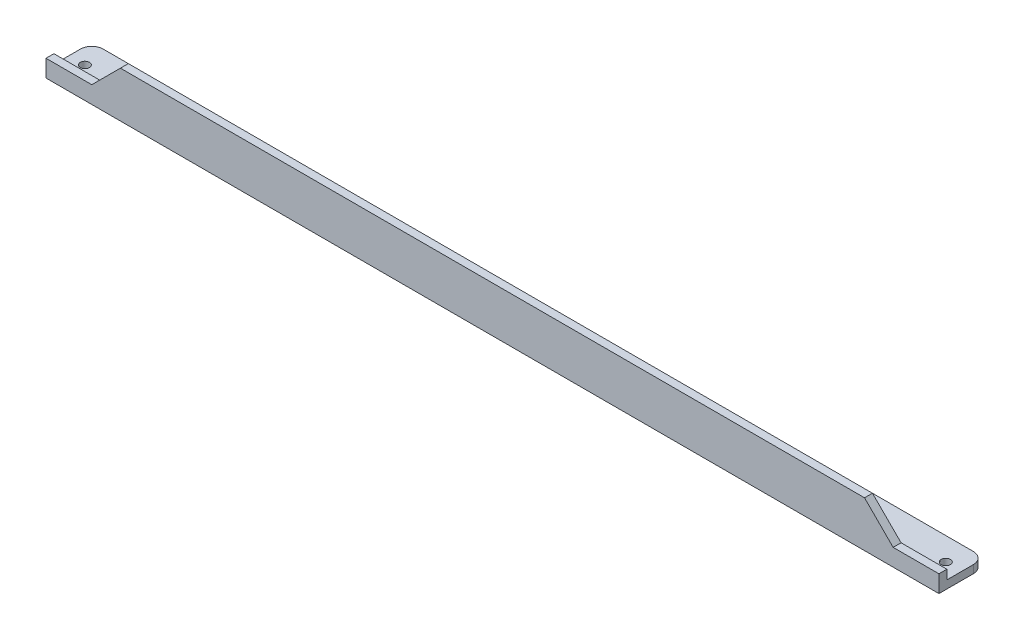
ISO-10303-21;
HEADER;
FILE_DESCRIPTION(('STEP AP214'),'2;1');
FILE_NAME('part.step','',(''),(''),'','','');
FILE_SCHEMA(('AUTOMOTIVE_DESIGN { 1 0 10303 214 1 1 1 1 }'));
ENDSEC;
DATA;
#1=APPLICATION_CONTEXT('core data for automotive mechanical design processes');
#2=APPLICATION_PROTOCOL_DEFINITION('international standard','automotive_design',2000,#1);
#3=PRODUCT_CONTEXT('',#1,'mechanical');
#4=PRODUCT('Part','Part','',(#3));
#5=PRODUCT_RELATED_PRODUCT_CATEGORY('part','',(#4));
#6=PRODUCT_DEFINITION_FORMATION('','',#4);
#7=PRODUCT_DEFINITION_CONTEXT('part definition',#1,'design');
#8=PRODUCT_DEFINITION('design','',#6,#7);
#9=PRODUCT_DEFINITION_SHAPE('','',#8);
#10=(LENGTH_UNIT() NAMED_UNIT(*) SI_UNIT(.MILLI.,.METRE.));
#11=(NAMED_UNIT(*) PLANE_ANGLE_UNIT() SI_UNIT($,.RADIAN.));
#12=(NAMED_UNIT(*) SI_UNIT($,.STERADIAN.) SOLID_ANGLE_UNIT());
#13=UNCERTAINTY_MEASURE_WITH_UNIT(LENGTH_MEASURE(1.E-05),#10,'distance_accuracy_value','');
#14=(GEOMETRIC_REPRESENTATION_CONTEXT(3) GLOBAL_UNCERTAINTY_ASSIGNED_CONTEXT((#13)) GLOBAL_UNIT_ASSIGNED_CONTEXT((#10,
#11,#12)) REPRESENTATION_CONTEXT('',''));
#15=CARTESIAN_POINT('',(0.,0.,0.));
#16=DIRECTION('',(0.,0.,1.));
#17=DIRECTION('',(1.,0.,0.));
#18=AXIS2_PLACEMENT_3D('',#15,#16,#17);
#19=CARTESIAN_POINT('',(390.,20.,0.));
#20=DIRECTION('',(0.,0.,-1.));
#21=DIRECTION('',(0.,1.,0.));
#22=AXIS2_PLACEMENT_3D('',#19,#20,#21);
#23=PLANE('',#22);
#24=DIRECTION('',(-1.,0.,0.));
#25=VECTOR('',#24,1.);
#26=CARTESIAN_POINT('',(390.,20.,0.));
#27=LINE('',#26,#25);
#28=CARTESIAN_POINT('',(357.5,20.,0.));
#29=VERTEX_POINT('',#28);
#30=CARTESIAN_POINT('',(32.5,20.,0.));
#31=VERTEX_POINT('',#30);
#32=EDGE_CURVE('E166',#29,#31,#27,.T.);
#33=ORIENTED_EDGE('',*,*,#32,.T.);
#34=DIRECTION('',(0.707106781186547,0.707106781186548,0.));
#35=VECTOR('',#34,1.);
#36=CARTESIAN_POINT('',(20.,7.49999999999995,0.));
#37=LINE('',#36,#35);
#38=CARTESIAN_POINT('',(20.,7.49999999999995,0.));
#39=VERTEX_POINT('',#38);
#40=EDGE_CURVE('E145',#39,#31,#37,.T.);
#41=ORIENTED_EDGE('',*,*,#40,.F.);
#42=DIRECTION('',(1.,0.,0.));
#43=VECTOR('',#42,1.);
#44=CARTESIAN_POINT('',(0.,7.49999999999995,0.));
#45=LINE('',#44,#43);
#46=CARTESIAN_POINT('',(0.,7.49999999999995,0.));
#47=VERTEX_POINT('',#46);
#48=EDGE_CURVE('E131',#47,#39,#45,.T.);
#49=ORIENTED_EDGE('',*,*,#48,.F.);
#50=DIRECTION('',(0.,-1.,0.));
#51=VECTOR('',#50,1.);
#52=CARTESIAN_POINT('',(0.,20.,0.));
#53=LINE('',#52,#51);
#54=CARTESIAN_POINT('',(0.,0.,0.));
#55=VERTEX_POINT('',#54);
#56=EDGE_CURVE('E144',#47,#55,#53,.T.);
#57=ORIENTED_EDGE('',*,*,#56,.T.);
#58=DIRECTION('',(-1.,0.,0.));
#59=VECTOR('',#58,1.);
#60=CARTESIAN_POINT('',(390.,0.,0.));
#61=LINE('',#60,#59);
#62=CARTESIAN_POINT('',(390.,0.,0.));
#63=VERTEX_POINT('',#62);
#64=EDGE_CURVE('E139',#63,#55,#61,.T.);
#65=ORIENTED_EDGE('',*,*,#64,.F.);
#66=DIRECTION('',(0.,-1.,0.));
#67=VECTOR('',#66,1.);
#68=CARTESIAN_POINT('',(390.,20.,0.));
#69=LINE('',#68,#67);
#70=CARTESIAN_POINT('',(390.,7.49999999999995,0.));
#71=VERTEX_POINT('',#70);
#72=EDGE_CURVE('E165',#71,#63,#69,.T.);
#73=ORIENTED_EDGE('',*,*,#72,.F.);
#74=DIRECTION('',(1.,0.,0.));
#75=VECTOR('',#74,1.);
#76=CARTESIAN_POINT('',(390.,7.49999999999995,0.));
#77=LINE('',#76,#75);
#78=CARTESIAN_POINT('',(370.,7.49999999999995,0.));
#79=VERTEX_POINT('',#78);
#80=EDGE_CURVE('E262',#79,#71,#77,.T.);
#81=ORIENTED_EDGE('',*,*,#80,.F.);
#82=DIRECTION('',(0.707106781186548,-0.707106781186547,0.));
#83=VECTOR('',#82,1.);
#84=CARTESIAN_POINT('',(370.,7.49999999999995,0.));
#85=LINE('',#84,#83);
#86=EDGE_CURVE('E146',#29,#79,#85,.T.);
#87=ORIENTED_EDGE('',*,*,#86,.F.);
#88=EDGE_LOOP('',(#33,#41,#49,#57,#65,#73,#81,#87));
#89=FACE_BOUND('',#88,.T.);
#90=ADVANCED_FACE('F37',(#89),#23,.F.);
#91=CARTESIAN_POINT('',(390.,0.,0.));
#92=DIRECTION('',(0.,1.,0.));
#93=DIRECTION('',(0.,0.,1.));
#94=AXIS2_PLACEMENT_3D('',#91,#92,#93);
#95=PLANE('',#94);
#96=CARTESIAN_POINT('',(335.,0.,-10.));
#97=DIRECTION('',(0.,-1.,0.));
#98=DIRECTION('',(0.,0.,-1.));
#99=AXIS2_PLACEMENT_3D('',#96,#97,#98);
#100=CIRCLE('',#99,2.);
#101=CARTESIAN_POINT('',(335.,0.,-12.));
#102=VERTEX_POINT('',#101);
#103=EDGE_CURVE('E241',#102,#102,#100,.T.);
#104=ORIENTED_EDGE('',*,*,#103,.F.);
#105=EDGE_LOOP('',(#104));
#106=FACE_BOUND('',#105,.T.);
#107=CARTESIAN_POINT('',(55.,0.,-10.));
#108=DIRECTION('',(0.,-1.,0.));
#109=DIRECTION('',(0.,0.,-1.));
#110=AXIS2_PLACEMENT_3D('',#107,#108,#109);
#111=CIRCLE('',#110,2.);
#112=CARTESIAN_POINT('',(55.,0.,-12.));
#113=VERTEX_POINT('',#112);
#114=EDGE_CURVE('E242',#113,#113,#111,.T.);
#115=ORIENTED_EDGE('',*,*,#114,.F.);
#116=EDGE_LOOP('',(#115));
#117=FACE_BOUND('',#116,.T.);
#118=CARTESIAN_POINT('',(383.,0.,-10.));
#119=DIRECTION('',(0.,-1.,0.));
#120=DIRECTION('',(0.,0.,-1.));
#121=AXIS2_PLACEMENT_3D('',#118,#119,#120);
#122=CIRCLE('',#121,2.);
#123=CARTESIAN_POINT('',(383.,0.,-12.));
#124=VERTEX_POINT('',#123);
#125=EDGE_CURVE('E245',#124,#124,#122,.T.);
#126=ORIENTED_EDGE('',*,*,#125,.F.);
#127=EDGE_LOOP('',(#126));
#128=FACE_BOUND('',#127,.T.);
#129=CARTESIAN_POINT('',(6.99999999999999,0.,-10.));
#130=DIRECTION('',(0.,-1.,0.));
#131=DIRECTION('',(0.,0.,-1.));
#132=AXIS2_PLACEMENT_3D('',#129,#130,#131);
#133=CIRCLE('',#132,2.);
#134=CARTESIAN_POINT('',(6.99999999999999,0.,-12.));
#135=VERTEX_POINT('',#134);
#136=EDGE_CURVE('E248',#135,#135,#133,.T.);
#137=ORIENTED_EDGE('',*,*,#136,.F.);
#138=EDGE_LOOP('',(#137));
#139=FACE_BOUND('',#138,.T.);
#140=CARTESIAN_POINT('',(195.,0.,-10.));
#141=DIRECTION('',(0.,-1.,0.));
#142=DIRECTION('',(0.,0.,-1.));
#143=AXIS2_PLACEMENT_3D('',#140,#141,#142);
#144=CIRCLE('',#143,2.);
#145=CARTESIAN_POINT('',(195.,0.,-12.));
#146=VERTEX_POINT('',#145);
#147=EDGE_CURVE('E184',#146,#146,#144,.T.);
#148=ORIENTED_EDGE('',*,*,#147,.F.);
#149=EDGE_LOOP('',(#148));
#150=FACE_BOUND('',#149,.T.);
#151=DIRECTION('',(-1.,0.,0.));
#152=VECTOR('',#151,1.);
#153=CARTESIAN_POINT('',(390.,0.,-20.));
#154=LINE('',#153,#152);
#155=CARTESIAN_POINT('',(385.,0.,-20.));
#156=VERTEX_POINT('',#155);
#157=CARTESIAN_POINT('',(5.,0.,-20.));
#158=VERTEX_POINT('',#157);
#159=EDGE_CURVE('E177',#156,#158,#154,.T.);
#160=ORIENTED_EDGE('',*,*,#159,.F.);
#161=CARTESIAN_POINT('',(385.,0.,-15.));
#162=DIRECTION('',(0.,1.,0.));
#163=DIRECTION('',(0.,0.,1.));
#164=AXIS2_PLACEMENT_3D('',#161,#162,#163);
#165=CIRCLE('',#164,5.);
#166=CARTESIAN_POINT('',(390.,0.,-15.));
#167=VERTEX_POINT('',#166);
#168=EDGE_CURVE('E45',#156,#167,#165,.F.);
#169=ORIENTED_EDGE('',*,*,#168,.T.);
#170=DIRECTION('',(0.,0.,-1.));
#171=VECTOR('',#170,1.);
#172=CARTESIAN_POINT('',(390.,0.,0.));
#173=LINE('',#172,#171);
#174=EDGE_CURVE('E209',#63,#167,#173,.T.);
#175=ORIENTED_EDGE('',*,*,#174,.F.);
#176=ORIENTED_EDGE('',*,*,#64,.T.);
#177=DIRECTION('',(0.,0.,-1.));
#178=VECTOR('',#177,1.);
#179=CARTESIAN_POINT('',(0.,0.,0.));
#180=LINE('',#179,#178);
#181=CARTESIAN_POINT('',(0.,0.,-15.));
#182=VERTEX_POINT('',#181);
#183=EDGE_CURVE('E149',#55,#182,#180,.T.);
#184=ORIENTED_EDGE('',*,*,#183,.T.);
#185=CARTESIAN_POINT('',(5.,0.,-15.));
#186=DIRECTION('',(0.,1.,0.));
#187=DIRECTION('',(0.,0.,1.));
#188=AXIS2_PLACEMENT_3D('',#185,#186,#187);
#189=CIRCLE('',#188,5.);
#190=EDGE_CURVE('E57',#182,#158,#189,.F.);
#191=ORIENTED_EDGE('',*,*,#190,.T.);
#192=EDGE_LOOP('',(#160,#169,#175,#176,#184,#191));
#193=FACE_BOUND('',#192,.T.);
#194=ADVANCED_FACE('F208',(#106,#117,#128,#139,#150,#193),#95,.F.);
#195=CARTESIAN_POINT('',(390.,0.,-20.));
#196=DIRECTION('',(0.,0.,1.));
#197=DIRECTION('',(1.,0.,0.));
#198=AXIS2_PLACEMENT_3D('',#195,#196,#197);
#199=PLANE('',#198);
#200=DIRECTION('',(-1.,0.,0.));
#201=VECTOR('',#200,1.);
#202=CARTESIAN_POINT('',(390.,3.46117846701572,-20.));
#203=LINE('',#202,#201);
#204=CARTESIAN_POINT('',(385.,3.46117846701572,-20.));
#205=VERTEX_POINT('',#204);
#206=CARTESIAN_POINT('',(5.,3.46117846701572,-20.));
#207=VERTEX_POINT('',#206);
#208=EDGE_CURVE('E174',#205,#207,#203,.T.);
#209=ORIENTED_EDGE('',*,*,#208,.F.);
#210=DIRECTION('',(0.,1.,0.));
#211=VECTOR('',#210,1.);
#212=CARTESIAN_POINT('',(385.,0.,-20.));
#213=LINE('',#212,#211);
#214=EDGE_CURVE('E203',#205,#156,#213,.F.);
#215=ORIENTED_EDGE('',*,*,#214,.T.);
#216=ORIENTED_EDGE('',*,*,#159,.T.);
#217=DIRECTION('',(0.,1.,0.));
#218=VECTOR('',#217,1.);
#219=CARTESIAN_POINT('',(5.,0.,-20.));
#220=LINE('',#219,#218);
#221=EDGE_CURVE('E200',#158,#207,#220,.T.);
#222=ORIENTED_EDGE('',*,*,#221,.T.);
#223=EDGE_LOOP('',(#209,#215,#216,#222));
#224=FACE_BOUND('',#223,.T.);
#225=ADVANCED_FACE('F226',(#224),#199,.F.);
#226=CARTESIAN_POINT('',(390.,3.46117846701572,-20.));
#227=DIRECTION('',(0.,-1.,0.));
#228=DIRECTION('',(0.,0.,-1.));
#229=AXIS2_PLACEMENT_3D('',#226,#227,#228);
#230=PLANE('',#229);
#231=CARTESIAN_POINT('',(335.,3.46117846701572,-10.));
#232=DIRECTION('',(0.,-1.,0.));
#233=DIRECTION('',(0.,0.,-1.));
#234=AXIS2_PLACEMENT_3D('',#231,#232,#233);
#235=CIRCLE('',#234,2.);
#236=CARTESIAN_POINT('',(335.,3.46117846701572,-12.));
#237=VERTEX_POINT('',#236);
#238=EDGE_CURVE('E151',#237,#237,#235,.T.);
#239=ORIENTED_EDGE('',*,*,#238,.T.);
#240=EDGE_LOOP('',(#239));
#241=FACE_BOUND('',#240,.T.);
#242=CARTESIAN_POINT('',(55.,3.46117846701572,-10.));
#243=DIRECTION('',(0.,-1.,0.));
#244=DIRECTION('',(0.,0.,-1.));
#245=AXIS2_PLACEMENT_3D('',#242,#243,#244);
#246=CIRCLE('',#245,2.);
#247=CARTESIAN_POINT('',(55.,3.46117846701572,-12.));
#248=VERTEX_POINT('',#247);
#249=EDGE_CURVE('E156',#248,#248,#246,.T.);
#250=ORIENTED_EDGE('',*,*,#249,.T.);
#251=EDGE_LOOP('',(#250));
#252=FACE_BOUND('',#251,.T.);
#253=CARTESIAN_POINT('',(383.,3.46117846701572,-10.));
#254=DIRECTION('',(0.,-1.,0.));
#255=DIRECTION('',(0.,0.,-1.));
#256=AXIS2_PLACEMENT_3D('',#253,#254,#255);
#257=CIRCLE('',#256,2.);
#258=CARTESIAN_POINT('',(383.,3.46117846701572,-12.));
#259=VERTEX_POINT('',#258);
#260=EDGE_CURVE('E187',#259,#259,#257,.T.);
#261=ORIENTED_EDGE('',*,*,#260,.T.);
#262=EDGE_LOOP('',(#261));
#263=FACE_BOUND('',#262,.T.);
#264=CARTESIAN_POINT('',(6.99999999999999,3.46117846701572,-10.));
#265=DIRECTION('',(0.,-1.,0.));
#266=DIRECTION('',(0.,0.,-1.));
#267=AXIS2_PLACEMENT_3D('',#264,#265,#266);
#268=CIRCLE('',#267,2.);
#269=CARTESIAN_POINT('',(6.99999999999999,3.46117846701572,-12.));
#270=VERTEX_POINT('',#269);
#271=EDGE_CURVE('E183',#270,#270,#268,.T.);
#272=ORIENTED_EDGE('',*,*,#271,.T.);
#273=EDGE_LOOP('',(#272));
#274=FACE_BOUND('',#273,.T.);
#275=CARTESIAN_POINT('',(195.,3.46117846701572,-10.));
#276=DIRECTION('',(0.,-1.,0.));
#277=DIRECTION('',(0.,0.,-1.));
#278=AXIS2_PLACEMENT_3D('',#275,#276,#277);
#279=CIRCLE('',#278,2.);
#280=CARTESIAN_POINT('',(195.,3.46117846701572,-12.));
#281=VERTEX_POINT('',#280);
#282=EDGE_CURVE('E180',#281,#281,#279,.T.);
#283=ORIENTED_EDGE('',*,*,#282,.T.);
#284=EDGE_LOOP('',(#283));
#285=FACE_BOUND('',#284,.T.);
#286=DIRECTION('',(0.,0.,1.));
#287=VECTOR('',#286,1.);
#288=CARTESIAN_POINT('',(390.,3.46117846701572,-20.));
#289=LINE('',#288,#287);
#290=CARTESIAN_POINT('',(390.,3.46117846701572,-15.));
#291=VERTEX_POINT('',#290);
#292=CARTESIAN_POINT('',(390.,3.46117846701572,-3.46117846701572));
#293=VERTEX_POINT('',#292);
#294=EDGE_CURVE('E218',#291,#293,#289,.T.);
#295=ORIENTED_EDGE('',*,*,#294,.F.);
#296=CARTESIAN_POINT('',(385.,3.46117846701572,-15.));
#297=DIRECTION('',(0.,-1.,0.));
#298=DIRECTION('',(0.,0.,-1.));
#299=AXIS2_PLACEMENT_3D('',#296,#297,#298);
#300=CIRCLE('',#299,5.);
#301=EDGE_CURVE('E198',#291,#205,#300,.F.);
#302=ORIENTED_EDGE('',*,*,#301,.T.);
#303=ORIENTED_EDGE('',*,*,#208,.T.);
#304=CARTESIAN_POINT('',(5.,3.46117846701572,-15.));
#305=DIRECTION('',(0.,-1.,0.));
#306=DIRECTION('',(0.,0.,-1.));
#307=AXIS2_PLACEMENT_3D('',#304,#305,#306);
#308=CIRCLE('',#307,5.);
#309=CARTESIAN_POINT('',(0.,3.46117846701572,-15.));
#310=VERTEX_POINT('',#309);
#311=EDGE_CURVE('E196',#207,#310,#308,.F.);
#312=ORIENTED_EDGE('',*,*,#311,.T.);
#313=DIRECTION('',(0.,0.,1.));
#314=VECTOR('',#313,1.);
#315=CARTESIAN_POINT('',(0.,3.46117846701572,-20.));
#316=LINE('',#315,#314);
#317=CARTESIAN_POINT('',(0.,3.46117846701572,-3.46117846701572));
#318=VERTEX_POINT('',#317);
#319=EDGE_CURVE('E153',#310,#318,#316,.T.);
#320=ORIENTED_EDGE('',*,*,#319,.T.);
#321=DIRECTION('',(-1.,0.,0.));
#322=VECTOR('',#321,1.);
#323=CARTESIAN_POINT('',(390.,3.46117846701572,-3.46117846701572));
#324=LINE('',#323,#322);
#325=EDGE_CURVE('E171',#293,#318,#324,.T.);
#326=ORIENTED_EDGE('',*,*,#325,.F.);
#327=EDGE_LOOP('',(#295,#302,#303,#312,#320,#326));
#328=FACE_BOUND('',#327,.T.);
#329=ADVANCED_FACE('F223',(#241,#252,#263,#274,#285,#328),#230,.F.);
#330=CARTESIAN_POINT('',(390.,3.46117846701572,-3.46117846701572));
#331=DIRECTION('',(0.,0.,1.));
#332=DIRECTION('',(1.,0.,0.));
#333=AXIS2_PLACEMENT_3D('',#330,#331,#332);
#334=PLANE('',#333);
#335=DIRECTION('',(1.,0.,0.));
#336=VECTOR('',#335,1.);
#337=CARTESIAN_POINT('',(390.,7.49999999999997,-3.46117846701572));
#338=LINE('',#337,#336);
#339=CARTESIAN_POINT('',(0.,7.49999999999995,-3.46117846701572));
#340=VERTEX_POINT('',#339);
#341=CARTESIAN_POINT('',(20.,7.49999999999995,-3.46117846701572));
#342=VERTEX_POINT('',#341);
#343=EDGE_CURVE('E134',#340,#342,#338,.T.);
#344=ORIENTED_EDGE('',*,*,#343,.T.);
#345=DIRECTION('',(0.707106781186547,0.707106781186548,0.));
#346=VECTOR('',#345,1.);
#347=CARTESIAN_POINT('',(202.980589233508,190.480589233508,-3.46117846701572));
#348=LINE('',#347,#346);
#349=CARTESIAN_POINT('',(32.5,20.,-3.46117846701572));
#350=VERTEX_POINT('',#349);
#351=EDGE_CURVE('E251',#342,#350,#348,.T.);
#352=ORIENTED_EDGE('',*,*,#351,.T.);
#353=DIRECTION('',(-1.,0.,0.));
#354=VECTOR('',#353,1.);
#355=CARTESIAN_POINT('',(390.,20.,-3.46117846701572));
#356=LINE('',#355,#354);
#357=CARTESIAN_POINT('',(357.5,20.,-3.46117846701572));
#358=VERTEX_POINT('',#357);
#359=EDGE_CURVE('E168',#358,#350,#356,.T.);
#360=ORIENTED_EDGE('',*,*,#359,.F.);
#361=DIRECTION('',(0.707106781186548,-0.707106781186547,0.));
#362=VECTOR('',#361,1.);
#363=CARTESIAN_POINT('',(382.019410766492,-4.51941076649214,-3.46117846701572));
#364=LINE('',#363,#362);
#365=CARTESIAN_POINT('',(370.,7.49999999999995,-3.46117846701572));
#366=VERTEX_POINT('',#365);
#367=EDGE_CURVE('E255',#358,#366,#364,.T.);
#368=ORIENTED_EDGE('',*,*,#367,.T.);
#369=DIRECTION('',(1.,0.,0.));
#370=VECTOR('',#369,1.);
#371=CARTESIAN_POINT('',(390.,7.49999999999995,-3.46117846701572));
#372=LINE('',#371,#370);
#373=CARTESIAN_POINT('',(390.,7.49999999999995,-3.46117846701572));
#374=VERTEX_POINT('',#373);
#375=EDGE_CURVE('E236',#366,#374,#372,.T.);
#376=ORIENTED_EDGE('',*,*,#375,.T.);
#377=DIRECTION('',(0.,1.,0.));
#378=VECTOR('',#377,1.);
#379=CARTESIAN_POINT('',(390.,3.46117846701572,-3.46117846701572));
#380=LINE('',#379,#378);
#381=EDGE_CURVE('E159',#293,#374,#380,.T.);
#382=ORIENTED_EDGE('',*,*,#381,.F.);
#383=ORIENTED_EDGE('',*,*,#325,.T.);
#384=DIRECTION('',(0.,1.,0.));
#385=VECTOR('',#384,1.);
#386=CARTESIAN_POINT('',(0.,3.46117846701572,-3.46117846701572));
#387=LINE('',#386,#385);
#388=EDGE_CURVE('E163',#318,#340,#387,.T.);
#389=ORIENTED_EDGE('',*,*,#388,.T.);
#390=EDGE_LOOP('',(#344,#352,#360,#368,#376,#382,#383,#389));
#391=FACE_BOUND('',#390,.T.);
#392=ADVANCED_FACE('F230',(#391),#334,.F.);
#393=CARTESIAN_POINT('',(390.,20.,-3.46117846701572));
#394=DIRECTION('',(0.,-1.,0.));
#395=DIRECTION('',(0.,0.,-1.));
#396=AXIS2_PLACEMENT_3D('',#393,#394,#395);
#397=PLANE('',#396);
#398=ORIENTED_EDGE('',*,*,#359,.T.);
#399=DIRECTION('',(0.,0.,1.));
#400=VECTOR('',#399,1.);
#401=CARTESIAN_POINT('',(32.5,20.,-20.));
#402=LINE('',#401,#400);
#403=EDGE_CURVE('E259',#350,#31,#402,.T.);
#404=ORIENTED_EDGE('',*,*,#403,.T.);
#405=ORIENTED_EDGE('',*,*,#32,.F.);
#406=DIRECTION('',(0.,0.,1.));
#407=VECTOR('',#406,1.);
#408=CARTESIAN_POINT('',(357.5,20.,-20.));
#409=LINE('',#408,#407);
#410=EDGE_CURVE('E264',#358,#29,#409,.T.);
#411=ORIENTED_EDGE('',*,*,#410,.F.);
#412=EDGE_LOOP('',(#398,#404,#405,#411));
#413=FACE_BOUND('',#412,.T.);
#414=ADVANCED_FACE('F276',(#413),#397,.F.);
#415=CARTESIAN_POINT('',(390.,0.,0.));
#416=DIRECTION('',(1.,0.,0.));
#417=DIRECTION('',(0.,0.,-1.));
#418=AXIS2_PLACEMENT_3D('',#415,#416,#417);
#419=PLANE('',#418);
#420=ORIENTED_EDGE('',*,*,#174,.T.);
#421=DIRECTION('',(0.,1.,0.));
#422=VECTOR('',#421,1.);
#423=CARTESIAN_POINT('',(390.,3.46117846701572,-15.));
#424=LINE('',#423,#422);
#425=EDGE_CURVE('E193',#167,#291,#424,.T.);
#426=ORIENTED_EDGE('',*,*,#425,.T.);
#427=ORIENTED_EDGE('',*,*,#294,.T.);
#428=ORIENTED_EDGE('',*,*,#381,.T.);
#429=DIRECTION('',(0.,0.,-1.));
#430=VECTOR('',#429,1.);
#431=CARTESIAN_POINT('',(390.,7.49999999999995,0.));
#432=LINE('',#431,#430);
#433=EDGE_CURVE('E138',#71,#374,#432,.T.);
#434=ORIENTED_EDGE('',*,*,#433,.F.);
#435=ORIENTED_EDGE('',*,*,#72,.T.);
#436=EDGE_LOOP('',(#420,#426,#427,#428,#434,#435));
#437=FACE_BOUND('',#436,.T.);
#438=ADVANCED_FACE('F214',(#437),#419,.T.);
#439=CARTESIAN_POINT('',(0.,0.,0.));
#440=DIRECTION('',(1.,0.,0.));
#441=DIRECTION('',(0.,0.,-1.));
#442=AXIS2_PLACEMENT_3D('',#439,#440,#441);
#443=PLANE('',#442);
#444=ORIENTED_EDGE('',*,*,#319,.F.);
#445=DIRECTION('',(0.,1.,0.));
#446=VECTOR('',#445,1.);
#447=CARTESIAN_POINT('',(0.,0.,-15.));
#448=LINE('',#447,#446);
#449=EDGE_CURVE('E11',#310,#182,#448,.F.);
#450=ORIENTED_EDGE('',*,*,#449,.T.);
#451=ORIENTED_EDGE('',*,*,#183,.F.);
#452=ORIENTED_EDGE('',*,*,#56,.F.);
#453=DIRECTION('',(0.,0.,-1.));
#454=VECTOR('',#453,1.);
#455=CARTESIAN_POINT('',(0.,7.49999999999995,0.));
#456=LINE('',#455,#454);
#457=EDGE_CURVE('E127',#47,#340,#456,.T.);
#458=ORIENTED_EDGE('',*,*,#457,.T.);
#459=ORIENTED_EDGE('',*,*,#388,.F.);
#460=EDGE_LOOP('',(#444,#450,#451,#452,#458,#459));
#461=FACE_BOUND('',#460,.T.);
#462=ADVANCED_FACE('F148',(#461),#443,.F.);
#463=CARTESIAN_POINT('',(195.,20.,-10.));
#464=DIRECTION('',(0.,-1.,0.));
#465=DIRECTION('',(0.,0.,-1.));
#466=AXIS2_PLACEMENT_3D('',#463,#464,#465);
#467=CYLINDRICAL_SURFACE('',#466,2.);
#468=ORIENTED_EDGE('',*,*,#147,.T.);
#469=EDGE_LOOP('',(#468));
#470=FACE_BOUND('',#469,.T.);
#471=ORIENTED_EDGE('',*,*,#282,.F.);
#472=EDGE_LOOP('',(#471));
#473=FACE_BOUND('',#472,.T.);
#474=ADVANCED_FACE('F313',(#470,#473),#467,.F.);
#475=CARTESIAN_POINT('',(6.99999999999999,20.,-10.));
#476=DIRECTION('',(0.,-1.,0.));
#477=DIRECTION('',(0.,0.,-1.));
#478=AXIS2_PLACEMENT_3D('',#475,#476,#477);
#479=CYLINDRICAL_SURFACE('',#478,2.);
#480=ORIENTED_EDGE('',*,*,#136,.T.);
#481=EDGE_LOOP('',(#480));
#482=FACE_BOUND('',#481,.T.);
#483=ORIENTED_EDGE('',*,*,#271,.F.);
#484=EDGE_LOOP('',(#483));
#485=FACE_BOUND('',#484,.T.);
#486=ADVANCED_FACE('F318',(#482,#485),#479,.F.);
#487=CARTESIAN_POINT('',(383.,20.,-10.));
#488=DIRECTION('',(0.,-1.,0.));
#489=DIRECTION('',(0.,0.,-1.));
#490=AXIS2_PLACEMENT_3D('',#487,#488,#489);
#491=CYLINDRICAL_SURFACE('',#490,2.);
#492=ORIENTED_EDGE('',*,*,#125,.T.);
#493=EDGE_LOOP('',(#492));
#494=FACE_BOUND('',#493,.T.);
#495=ORIENTED_EDGE('',*,*,#260,.F.);
#496=EDGE_LOOP('',(#495));
#497=FACE_BOUND('',#496,.T.);
#498=ADVANCED_FACE('F324',(#494,#497),#491,.F.);
#499=CARTESIAN_POINT('',(55.,20.,-10.));
#500=DIRECTION('',(0.,-1.,0.));
#501=DIRECTION('',(0.,0.,-1.));
#502=AXIS2_PLACEMENT_3D('',#499,#500,#501);
#503=CYLINDRICAL_SURFACE('',#502,2.);
#504=ORIENTED_EDGE('',*,*,#114,.T.);
#505=EDGE_LOOP('',(#504));
#506=FACE_BOUND('',#505,.T.);
#507=ORIENTED_EDGE('',*,*,#249,.F.);
#508=EDGE_LOOP('',(#507));
#509=FACE_BOUND('',#508,.T.);
#510=ADVANCED_FACE('F320',(#506,#509),#503,.F.);
#511=CARTESIAN_POINT('',(335.,20.,-10.));
#512=DIRECTION('',(0.,-1.,0.));
#513=DIRECTION('',(0.,0.,-1.));
#514=AXIS2_PLACEMENT_3D('',#511,#512,#513);
#515=CYLINDRICAL_SURFACE('',#514,2.);
#516=ORIENTED_EDGE('',*,*,#103,.T.);
#517=EDGE_LOOP('',(#516));
#518=FACE_BOUND('',#517,.T.);
#519=ORIENTED_EDGE('',*,*,#238,.F.);
#520=EDGE_LOOP('',(#519));
#521=FACE_BOUND('',#520,.T.);
#522=ADVANCED_FACE('F323',(#518,#521),#515,.F.);
#523=CARTESIAN_POINT('',(20.,7.49999999999995,-20.));
#524=DIRECTION('',(0.707106781186548,-0.707106781186547,0.));
#525=DIRECTION('',(0.707106781186547,0.707106781186548,0.));
#526=AXIS2_PLACEMENT_3D('',#523,#524,#525);
#527=PLANE('',#526);
#528=DIRECTION('',(0.,0.,1.));
#529=VECTOR('',#528,1.);
#530=CARTESIAN_POINT('',(20.,7.49999999999995,-20.));
#531=LINE('',#530,#529);
#532=EDGE_CURVE('E268',#342,#39,#531,.T.);
#533=ORIENTED_EDGE('',*,*,#532,.T.);
#534=ORIENTED_EDGE('',*,*,#40,.T.);
#535=ORIENTED_EDGE('',*,*,#403,.F.);
#536=ORIENTED_EDGE('',*,*,#351,.F.);
#537=EDGE_LOOP('',(#533,#534,#535,#536));
#538=FACE_BOUND('',#537,.T.);
#539=ADVANCED_FACE('F273',(#538),#527,.F.);
#540=CARTESIAN_POINT('',(0.,7.49999999999995,-20.));
#541=DIRECTION('',(0.,-1.,0.));
#542=DIRECTION('',(1.,0.,0.));
#543=AXIS2_PLACEMENT_3D('',#540,#541,#542);
#544=PLANE('',#543);
#545=ORIENTED_EDGE('',*,*,#457,.F.);
#546=ORIENTED_EDGE('',*,*,#48,.T.);
#547=ORIENTED_EDGE('',*,*,#532,.F.);
#548=ORIENTED_EDGE('',*,*,#343,.F.);
#549=EDGE_LOOP('',(#545,#546,#547,#548));
#550=FACE_BOUND('',#549,.T.);
#551=ADVANCED_FACE('F129',(#550),#544,.F.);
#552=CARTESIAN_POINT('',(370.,7.49999999999995,-20.));
#553=DIRECTION('',(-0.707106781186547,-0.707106781186548,0.));
#554=DIRECTION('',(0.707106781186548,-0.707106781186547,0.));
#555=AXIS2_PLACEMENT_3D('',#552,#553,#554);
#556=PLANE('',#555);
#557=ORIENTED_EDGE('',*,*,#410,.T.);
#558=ORIENTED_EDGE('',*,*,#86,.T.);
#559=DIRECTION('',(0.,0.,1.));
#560=VECTOR('',#559,1.);
#561=CARTESIAN_POINT('',(370.,7.49999999999995,-20.));
#562=LINE('',#561,#560);
#563=EDGE_CURVE('E265',#366,#79,#562,.T.);
#564=ORIENTED_EDGE('',*,*,#563,.F.);
#565=ORIENTED_EDGE('',*,*,#367,.F.);
#566=EDGE_LOOP('',(#557,#558,#564,#565));
#567=FACE_BOUND('',#566,.T.);
#568=ADVANCED_FACE('F283',(#567),#556,.F.);
#569=CARTESIAN_POINT('',(390.,7.49999999999995,-20.));
#570=DIRECTION('',(0.,-1.,0.));
#571=DIRECTION('',(1.,0.,0.));
#572=AXIS2_PLACEMENT_3D('',#569,#570,#571);
#573=PLANE('',#572);
#574=ORIENTED_EDGE('',*,*,#563,.T.);
#575=ORIENTED_EDGE('',*,*,#80,.T.);
#576=ORIENTED_EDGE('',*,*,#433,.T.);
#577=ORIENTED_EDGE('',*,*,#375,.F.);
#578=EDGE_LOOP('',(#574,#575,#576,#577));
#579=FACE_BOUND('',#578,.T.);
#580=ADVANCED_FACE('F285',(#579),#573,.F.);
#581=CARTESIAN_POINT('',(385.,0.,-15.));
#582=DIRECTION('',(0.,-1.,0.));
#583=DIRECTION('',(0.,0.,-1.));
#584=AXIS2_PLACEMENT_3D('',#581,#582,#583);
#585=CYLINDRICAL_SURFACE('',#584,5.);
#586=ORIENTED_EDGE('',*,*,#168,.F.);
#587=ORIENTED_EDGE('',*,*,#214,.F.);
#588=ORIENTED_EDGE('',*,*,#301,.F.);
#589=ORIENTED_EDGE('',*,*,#425,.F.);
#590=EDGE_LOOP('',(#586,#587,#588,#589));
#591=FACE_BOUND('',#590,.T.);
#592=ADVANCED_FACE('F220',(#591),#585,.T.);
#593=CARTESIAN_POINT('',(5.,0.,-15.));
#594=DIRECTION('',(0.,1.,0.));
#595=DIRECTION('',(0.,0.,1.));
#596=AXIS2_PLACEMENT_3D('',#593,#594,#595);
#597=CYLINDRICAL_SURFACE('',#596,5.);
#598=ORIENTED_EDGE('',*,*,#190,.F.);
#599=ORIENTED_EDGE('',*,*,#449,.F.);
#600=ORIENTED_EDGE('',*,*,#311,.F.);
#601=ORIENTED_EDGE('',*,*,#221,.F.);
#602=EDGE_LOOP('',(#598,#599,#600,#601));
#603=FACE_BOUND('',#602,.T.);
#604=ADVANCED_FACE('F39',(#603),#597,.T.);
#605=CLOSED_SHELL('',(#90,#194,#225,#329,#392,#414,#438,#462,#474,#486,#498,#510,#522,#539,#551,
#568,#580,#592,#604));
#606=MANIFOLD_SOLID_BREP('B2',#605);
#607=ADVANCED_BREP_SHAPE_REPRESENTATION('',(#18,#606),#14);
#608=SHAPE_DEFINITION_REPRESENTATION(#9,#607);
ENDSEC;
END-ISO-10303-21;
